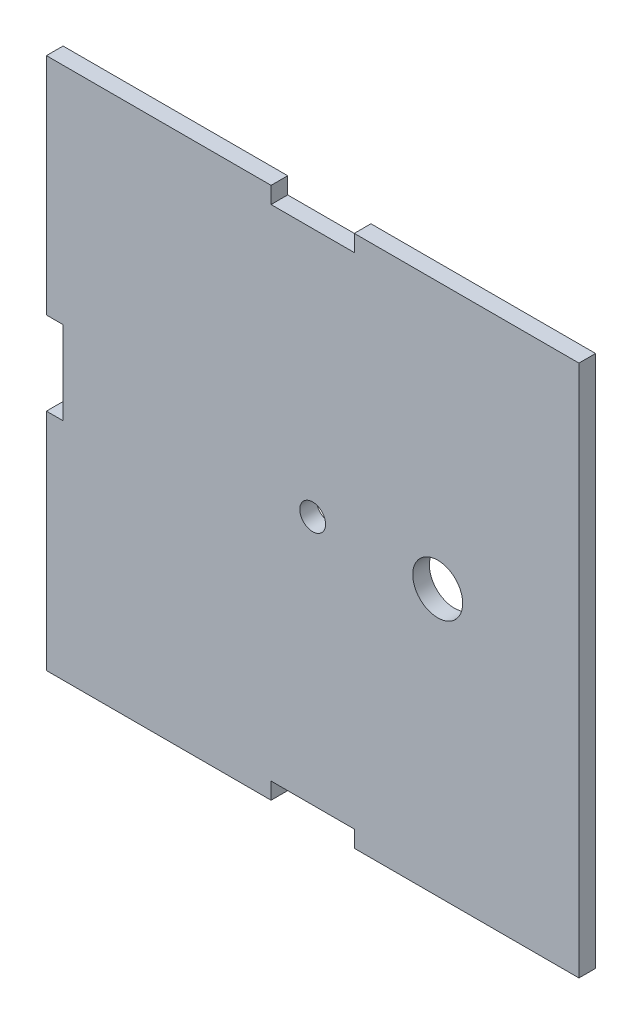
ISO-10303-21;
HEADER;
FILE_DESCRIPTION(('STEP AP214'),'2;1');
FILE_NAME('part.step','',(''),(''),'','','');
FILE_SCHEMA(('AUTOMOTIVE_DESIGN { 1 0 10303 214 1 1 1 1 }'));
ENDSEC;
DATA;
#1=APPLICATION_CONTEXT('core data for automotive mechanical design processes');
#2=APPLICATION_PROTOCOL_DEFINITION('international standard','automotive_design',2000,#1);
#3=PRODUCT_CONTEXT('',#1,'mechanical');
#4=PRODUCT('Part','Part','',(#3));
#5=PRODUCT_RELATED_PRODUCT_CATEGORY('part','',(#4));
#6=PRODUCT_DEFINITION_FORMATION('','',#4);
#7=PRODUCT_DEFINITION_CONTEXT('part definition',#1,'design');
#8=PRODUCT_DEFINITION('design','',#6,#7);
#9=PRODUCT_DEFINITION_SHAPE('','',#8);
#10=(LENGTH_UNIT() NAMED_UNIT(*) SI_UNIT(.MILLI.,.METRE.));
#11=(NAMED_UNIT(*) PLANE_ANGLE_UNIT() SI_UNIT($,.RADIAN.));
#12=(NAMED_UNIT(*) SI_UNIT($,.STERADIAN.) SOLID_ANGLE_UNIT());
#13=UNCERTAINTY_MEASURE_WITH_UNIT(LENGTH_MEASURE(1.E-05),#10,'distance_accuracy_value','');
#14=(GEOMETRIC_REPRESENTATION_CONTEXT(3) GLOBAL_UNCERTAINTY_ASSIGNED_CONTEXT((#13)) GLOBAL_UNIT_ASSIGNED_CONTEXT((#10,
#11,#12)) REPRESENTATION_CONTEXT('',''));
#15=CARTESIAN_POINT('',(0.,0.,0.));
#16=DIRECTION('',(0.,0.,1.));
#17=DIRECTION('',(1.,0.,0.));
#18=AXIS2_PLACEMENT_3D('',#15,#16,#17);
#19=CARTESIAN_POINT('',(16.974358974359,0.,2.));
#20=DIRECTION('',(1.,0.,0.));
#21=DIRECTION('',(0.,0.,-1.));
#22=AXIS2_PLACEMENT_3D('',#19,#20,#21);
#23=PLANE('',#22);
#24=DIRECTION('',(0.,-1.,0.));
#25=VECTOR('',#24,1.);
#26=CARTESIAN_POINT('',(16.974358974359,0.,0.));
#27=LINE('',#26,#25);
#28=CARTESIAN_POINT('',(16.974358974359,42.2051282051282,0.));
#29=VERTEX_POINT('',#28);
#30=CARTESIAN_POINT('',(16.974358974359,-21.7948717948718,0.));
#31=VERTEX_POINT('',#30);
#32=EDGE_CURVE('E184',#29,#31,#27,.T.);
#33=ORIENTED_EDGE('',*,*,#32,.F.);
#34=DIRECTION('',(0.,0.,-1.));
#35=VECTOR('',#34,1.);
#36=CARTESIAN_POINT('',(16.974358974359,42.2051282051282,2.));
#37=LINE('',#36,#35);
#38=CARTESIAN_POINT('',(16.974358974359,42.2051282051282,2.));
#39=VERTEX_POINT('',#38);
#40=EDGE_CURVE('E11',#39,#29,#37,.T.);
#41=ORIENTED_EDGE('',*,*,#40,.F.);
#42=DIRECTION('',(0.,-1.,0.));
#43=VECTOR('',#42,1.);
#44=CARTESIAN_POINT('',(16.974358974359,0.,2.));
#45=LINE('',#44,#43);
#46=CARTESIAN_POINT('',(16.974358974359,-21.7948717948718,2.));
#47=VERTEX_POINT('',#46);
#48=EDGE_CURVE('E220',#39,#47,#45,.T.);
#49=ORIENTED_EDGE('',*,*,#48,.T.);
#50=DIRECTION('',(0.,0.,-1.));
#51=VECTOR('',#50,1.);
#52=CARTESIAN_POINT('',(16.974358974359,-21.7948717948718,2.));
#53=LINE('',#52,#51);
#54=EDGE_CURVE('E58',#47,#31,#53,.T.);
#55=ORIENTED_EDGE('',*,*,#54,.T.);
#56=EDGE_LOOP('',(#33,#41,#49,#55));
#57=FACE_BOUND('',#56,.T.);
#58=ADVANCED_FACE('F41',(#57),#23,.T.);
#59=CARTESIAN_POINT('',(0.,42.2051282051282,2.));
#60=DIRECTION('',(0.,-1.,0.));
#61=DIRECTION('',(0.,0.,-1.));
#62=AXIS2_PLACEMENT_3D('',#59,#60,#61);
#63=PLANE('',#62);
#64=DIRECTION('',(-1.,0.,0.));
#65=VECTOR('',#64,1.);
#66=CARTESIAN_POINT('',(0.,42.2051282051282,0.));
#67=LINE('',#66,#65);
#68=CARTESIAN_POINT('',(-10.025641025641,42.2051282051282,0.));
#69=VERTEX_POINT('',#68);
#70=EDGE_CURVE('E186',#29,#69,#67,.T.);
#71=ORIENTED_EDGE('',*,*,#70,.T.);
#72=DIRECTION('',(0.,0.,-1.));
#73=VECTOR('',#72,1.);
#74=CARTESIAN_POINT('',(-10.025641025641,42.2051282051282,2.));
#75=LINE('',#74,#73);
#76=CARTESIAN_POINT('',(-10.025641025641,42.2051282051282,2.));
#77=VERTEX_POINT('',#76);
#78=EDGE_CURVE('E50',#77,#69,#75,.T.);
#79=ORIENTED_EDGE('',*,*,#78,.F.);
#80=DIRECTION('',(-1.,0.,0.));
#81=VECTOR('',#80,1.);
#82=CARTESIAN_POINT('',(0.,42.2051282051282,2.));
#83=LINE('',#82,#81);
#84=EDGE_CURVE('E416',#39,#77,#83,.T.);
#85=ORIENTED_EDGE('',*,*,#84,.F.);
#86=ORIENTED_EDGE('',*,*,#40,.T.);
#87=EDGE_LOOP('',(#71,#79,#85,#86));
#88=FACE_BOUND('',#87,.T.);
#89=ADVANCED_FACE('F313',(#88),#63,.F.);
#90=CARTESIAN_POINT('',(-10.025641025641,0.,2.));
#91=DIRECTION('',(1.,0.,0.));
#92=DIRECTION('',(0.,0.,-1.));
#93=AXIS2_PLACEMENT_3D('',#90,#91,#92);
#94=PLANE('',#93);
#95=DIRECTION('',(0.,-1.,0.));
#96=VECTOR('',#95,1.);
#97=CARTESIAN_POINT('',(-10.025641025641,0.,0.));
#98=LINE('',#97,#96);
#99=CARTESIAN_POINT('',(-10.025641025641,40.2051282051282,0.));
#100=VERTEX_POINT('',#99);
#101=EDGE_CURVE('E189',#69,#100,#98,.T.);
#102=ORIENTED_EDGE('',*,*,#101,.T.);
#103=DIRECTION('',(0.,0.,-1.));
#104=VECTOR('',#103,1.);
#105=CARTESIAN_POINT('',(-10.025641025641,40.2051282051282,2.));
#106=LINE('',#105,#104);
#107=CARTESIAN_POINT('',(-10.025641025641,40.2051282051282,2.));
#108=VERTEX_POINT('',#107);
#109=EDGE_CURVE('E249',#108,#100,#106,.T.);
#110=ORIENTED_EDGE('',*,*,#109,.F.);
#111=DIRECTION('',(0.,-1.,0.));
#112=VECTOR('',#111,1.);
#113=CARTESIAN_POINT('',(-10.025641025641,0.,2.));
#114=LINE('',#113,#112);
#115=EDGE_CURVE('E259',#77,#108,#114,.T.);
#116=ORIENTED_EDGE('',*,*,#115,.F.);
#117=ORIENTED_EDGE('',*,*,#78,.T.);
#118=EDGE_LOOP('',(#102,#110,#116,#117));
#119=FACE_BOUND('',#118,.T.);
#120=ADVANCED_FACE('F257',(#119),#94,.F.);
#121=CARTESIAN_POINT('',(0.,40.2051282051282,2.));
#122=DIRECTION('',(0.,-1.,0.));
#123=DIRECTION('',(0.,0.,-1.));
#124=AXIS2_PLACEMENT_3D('',#121,#122,#123);
#125=PLANE('',#124);
#126=DIRECTION('',(-1.,0.,0.));
#127=VECTOR('',#126,1.);
#128=CARTESIAN_POINT('',(0.,40.2051282051282,0.));
#129=LINE('',#128,#127);
#130=CARTESIAN_POINT('',(-20.025641025641,40.2051282051282,0.));
#131=VERTEX_POINT('',#130);
#132=EDGE_CURVE('E191',#100,#131,#129,.T.);
#133=ORIENTED_EDGE('',*,*,#132,.T.);
#134=DIRECTION('',(0.,0.,-1.));
#135=VECTOR('',#134,1.);
#136=CARTESIAN_POINT('',(-20.025641025641,40.2051282051282,2.));
#137=LINE('',#136,#135);
#138=CARTESIAN_POINT('',(-20.025641025641,40.2051282051282,2.));
#139=VERTEX_POINT('',#138);
#140=EDGE_CURVE('E246',#139,#131,#137,.T.);
#141=ORIENTED_EDGE('',*,*,#140,.F.);
#142=DIRECTION('',(-1.,0.,0.));
#143=VECTOR('',#142,1.);
#144=CARTESIAN_POINT('',(0.,40.2051282051282,2.));
#145=LINE('',#144,#143);
#146=EDGE_CURVE('E278',#108,#139,#145,.T.);
#147=ORIENTED_EDGE('',*,*,#146,.F.);
#148=ORIENTED_EDGE('',*,*,#109,.T.);
#149=EDGE_LOOP('',(#133,#141,#147,#148));
#150=FACE_BOUND('',#149,.T.);
#151=ADVANCED_FACE('F269',(#150),#125,.F.);
#152=CARTESIAN_POINT('',(-20.025641025641,0.,2.));
#153=DIRECTION('',(-1.,0.,0.));
#154=DIRECTION('',(0.,0.,1.));
#155=AXIS2_PLACEMENT_3D('',#152,#153,#154);
#156=PLANE('',#155);
#157=DIRECTION('',(0.,1.,0.));
#158=VECTOR('',#157,1.);
#159=CARTESIAN_POINT('',(-20.025641025641,0.,0.));
#160=LINE('',#159,#158);
#161=CARTESIAN_POINT('',(-20.025641025641,42.2051282051282,0.));
#162=VERTEX_POINT('',#161);
#163=EDGE_CURVE('E193',#131,#162,#160,.T.);
#164=ORIENTED_EDGE('',*,*,#163,.T.);
#165=DIRECTION('',(0.,0.,-1.));
#166=VECTOR('',#165,1.);
#167=CARTESIAN_POINT('',(-20.025641025641,42.2051282051282,2.));
#168=LINE('',#167,#166);
#169=CARTESIAN_POINT('',(-20.025641025641,42.2051282051282,2.));
#170=VERTEX_POINT('',#169);
#171=EDGE_CURVE('E243',#170,#162,#168,.T.);
#172=ORIENTED_EDGE('',*,*,#171,.F.);
#173=DIRECTION('',(0.,1.,0.));
#174=VECTOR('',#173,1.);
#175=CARTESIAN_POINT('',(-20.025641025641,0.,2.));
#176=LINE('',#175,#174);
#177=EDGE_CURVE('E275',#139,#170,#176,.T.);
#178=ORIENTED_EDGE('',*,*,#177,.F.);
#179=ORIENTED_EDGE('',*,*,#140,.T.);
#180=EDGE_LOOP('',(#164,#172,#178,#179));
#181=FACE_BOUND('',#180,.T.);
#182=ADVANCED_FACE('F273',(#181),#156,.F.);
#183=CARTESIAN_POINT('',(0.,42.2051282051282,2.));
#184=DIRECTION('',(0.,-1.,0.));
#185=DIRECTION('',(1.,0.,0.));
#186=AXIS2_PLACEMENT_3D('',#183,#184,#185);
#187=PLANE('',#186);
#188=DIRECTION('',(-1.,0.,0.));
#189=VECTOR('',#188,1.);
#190=CARTESIAN_POINT('',(0.,42.2051282051282,0.));
#191=LINE('',#190,#189);
#192=CARTESIAN_POINT('',(-47.025641025641,42.2051282051282,0.));
#193=VERTEX_POINT('',#192);
#194=EDGE_CURVE('E195',#162,#193,#191,.T.);
#195=ORIENTED_EDGE('',*,*,#194,.T.);
#196=DIRECTION('',(0.,0.,-1.));
#197=VECTOR('',#196,1.);
#198=CARTESIAN_POINT('',(-47.025641025641,42.2051282051282,2.));
#199=LINE('',#198,#197);
#200=CARTESIAN_POINT('',(-47.025641025641,42.2051282051282,2.));
#201=VERTEX_POINT('',#200);
#202=EDGE_CURVE('E240',#201,#193,#199,.T.);
#203=ORIENTED_EDGE('',*,*,#202,.F.);
#204=DIRECTION('',(-1.,0.,0.));
#205=VECTOR('',#204,1.);
#206=CARTESIAN_POINT('',(0.,42.2051282051282,2.));
#207=LINE('',#206,#205);
#208=EDGE_CURVE('E277',#170,#201,#207,.T.);
#209=ORIENTED_EDGE('',*,*,#208,.F.);
#210=ORIENTED_EDGE('',*,*,#171,.T.);
#211=EDGE_LOOP('',(#195,#203,#209,#210));
#212=FACE_BOUND('',#211,.T.);
#213=ADVANCED_FACE('F326',(#212),#187,.F.);
#214=CARTESIAN_POINT('',(-47.025641025641,0.,2.));
#215=DIRECTION('',(1.,0.,0.));
#216=DIRECTION('',(0.,1.,0.));
#217=AXIS2_PLACEMENT_3D('',#214,#215,#216);
#218=PLANE('',#217);
#219=DIRECTION('',(0.,-1.,0.));
#220=VECTOR('',#219,1.);
#221=CARTESIAN_POINT('',(-47.025641025641,0.,0.));
#222=LINE('',#221,#220);
#223=CARTESIAN_POINT('',(-47.025641025641,15.2051282051282,0.));
#224=VERTEX_POINT('',#223);
#225=EDGE_CURVE('E197',#193,#224,#222,.T.);
#226=ORIENTED_EDGE('',*,*,#225,.T.);
#227=DIRECTION('',(0.,0.,-1.));
#228=VECTOR('',#227,1.);
#229=CARTESIAN_POINT('',(-47.025641025641,15.2051282051282,2.));
#230=LINE('',#229,#228);
#231=CARTESIAN_POINT('',(-47.025641025641,15.2051282051282,2.));
#232=VERTEX_POINT('',#231);
#233=EDGE_CURVE('E237',#232,#224,#230,.T.);
#234=ORIENTED_EDGE('',*,*,#233,.F.);
#235=DIRECTION('',(0.,-1.,0.));
#236=VECTOR('',#235,1.);
#237=CARTESIAN_POINT('',(-47.025641025641,0.,2.));
#238=LINE('',#237,#236);
#239=EDGE_CURVE('E280',#201,#232,#238,.T.);
#240=ORIENTED_EDGE('',*,*,#239,.F.);
#241=ORIENTED_EDGE('',*,*,#202,.T.);
#242=EDGE_LOOP('',(#226,#234,#240,#241));
#243=FACE_BOUND('',#242,.T.);
#244=ADVANCED_FACE('F329',(#243),#218,.F.);
#245=CARTESIAN_POINT('',(0.,15.2051282051282,2.));
#246=DIRECTION('',(0.,1.,0.));
#247=DIRECTION('',(0.,0.,1.));
#248=AXIS2_PLACEMENT_3D('',#245,#246,#247);
#249=PLANE('',#248);
#250=DIRECTION('',(1.,0.,0.));
#251=VECTOR('',#250,1.);
#252=CARTESIAN_POINT('',(0.,15.2051282051282,0.));
#253=LINE('',#252,#251);
#254=CARTESIAN_POINT('',(-45.025641025641,15.2051282051282,0.));
#255=VERTEX_POINT('',#254);
#256=EDGE_CURVE('E199',#224,#255,#253,.T.);
#257=ORIENTED_EDGE('',*,*,#256,.T.);
#258=DIRECTION('',(0.,0.,-1.));
#259=VECTOR('',#258,1.);
#260=CARTESIAN_POINT('',(-45.025641025641,15.2051282051282,2.));
#261=LINE('',#260,#259);
#262=CARTESIAN_POINT('',(-45.025641025641,15.2051282051282,2.));
#263=VERTEX_POINT('',#262);
#264=EDGE_CURVE('E234',#263,#255,#261,.T.);
#265=ORIENTED_EDGE('',*,*,#264,.F.);
#266=DIRECTION('',(1.,0.,0.));
#267=VECTOR('',#266,1.);
#268=CARTESIAN_POINT('',(0.,15.2051282051282,2.));
#269=LINE('',#268,#267);
#270=EDGE_CURVE('E286',#232,#263,#269,.T.);
#271=ORIENTED_EDGE('',*,*,#270,.F.);
#272=ORIENTED_EDGE('',*,*,#233,.T.);
#273=EDGE_LOOP('',(#257,#265,#271,#272));
#274=FACE_BOUND('',#273,.T.);
#275=ADVANCED_FACE('F333',(#274),#249,.F.);
#276=CARTESIAN_POINT('',(-45.025641025641,0.,2.));
#277=DIRECTION('',(1.,0.,0.));
#278=DIRECTION('',(0.,0.,-1.));
#279=AXIS2_PLACEMENT_3D('',#276,#277,#278);
#280=PLANE('',#279);
#281=DIRECTION('',(0.,-1.,0.));
#282=VECTOR('',#281,1.);
#283=CARTESIAN_POINT('',(-45.025641025641,0.,0.));
#284=LINE('',#283,#282);
#285=CARTESIAN_POINT('',(-45.025641025641,5.2051282051282,0.));
#286=VERTEX_POINT('',#285);
#287=EDGE_CURVE('E201',#255,#286,#284,.T.);
#288=ORIENTED_EDGE('',*,*,#287,.T.);
#289=DIRECTION('',(0.,0.,-1.));
#290=VECTOR('',#289,1.);
#291=CARTESIAN_POINT('',(-45.025641025641,5.2051282051282,2.));
#292=LINE('',#291,#290);
#293=CARTESIAN_POINT('',(-45.025641025641,5.2051282051282,2.));
#294=VERTEX_POINT('',#293);
#295=EDGE_CURVE('E231',#294,#286,#292,.T.);
#296=ORIENTED_EDGE('',*,*,#295,.F.);
#297=DIRECTION('',(0.,-1.,0.));
#298=VECTOR('',#297,1.);
#299=CARTESIAN_POINT('',(-45.025641025641,0.,2.));
#300=LINE('',#299,#298);
#301=EDGE_CURVE('E288',#263,#294,#300,.T.);
#302=ORIENTED_EDGE('',*,*,#301,.F.);
#303=ORIENTED_EDGE('',*,*,#264,.T.);
#304=EDGE_LOOP('',(#288,#296,#302,#303));
#305=FACE_BOUND('',#304,.T.);
#306=ADVANCED_FACE('F337',(#305),#280,.F.);
#307=CARTESIAN_POINT('',(0.,5.20512820512822,2.));
#308=DIRECTION('',(0.,-1.,0.));
#309=DIRECTION('',(1.,0.,0.));
#310=AXIS2_PLACEMENT_3D('',#307,#308,#309);
#311=PLANE('',#310);
#312=DIRECTION('',(-1.,0.,0.));
#313=VECTOR('',#312,1.);
#314=CARTESIAN_POINT('',(0.,5.20512820512822,0.));
#315=LINE('',#314,#313);
#316=CARTESIAN_POINT('',(-47.025641025641,5.2051282051282,0.));
#317=VERTEX_POINT('',#316);
#318=EDGE_CURVE('E203',#286,#317,#315,.T.);
#319=ORIENTED_EDGE('',*,*,#318,.T.);
#320=DIRECTION('',(0.,0.,-1.));
#321=VECTOR('',#320,1.);
#322=CARTESIAN_POINT('',(-47.025641025641,5.2051282051282,2.));
#323=LINE('',#322,#321);
#324=CARTESIAN_POINT('',(-47.025641025641,5.2051282051282,2.));
#325=VERTEX_POINT('',#324);
#326=EDGE_CURVE('E228',#325,#317,#323,.T.);
#327=ORIENTED_EDGE('',*,*,#326,.F.);
#328=DIRECTION('',(-1.,0.,0.));
#329=VECTOR('',#328,1.);
#330=CARTESIAN_POINT('',(0.,5.20512820512822,2.));
#331=LINE('',#330,#329);
#332=EDGE_CURVE('E290',#294,#325,#331,.T.);
#333=ORIENTED_EDGE('',*,*,#332,.F.);
#334=ORIENTED_EDGE('',*,*,#295,.T.);
#335=EDGE_LOOP('',(#319,#327,#333,#334));
#336=FACE_BOUND('',#335,.T.);
#337=ADVANCED_FACE('F341',(#336),#311,.F.);
#338=CARTESIAN_POINT('',(-47.025641025641,0.,2.));
#339=DIRECTION('',(1.,0.,0.));
#340=DIRECTION('',(0.,0.,-1.));
#341=AXIS2_PLACEMENT_3D('',#338,#339,#340);
#342=PLANE('',#341);
#343=DIRECTION('',(0.,-1.,0.));
#344=VECTOR('',#343,1.);
#345=CARTESIAN_POINT('',(-47.025641025641,0.,0.));
#346=LINE('',#345,#344);
#347=CARTESIAN_POINT('',(-47.025641025641,-21.7948717948718,0.));
#348=VERTEX_POINT('',#347);
#349=EDGE_CURVE('E205',#317,#348,#346,.T.);
#350=ORIENTED_EDGE('',*,*,#349,.T.);
#351=DIRECTION('',(0.,0.,-1.));
#352=VECTOR('',#351,1.);
#353=CARTESIAN_POINT('',(-47.025641025641,-21.7948717948718,2.));
#354=LINE('',#353,#352);
#355=CARTESIAN_POINT('',(-47.025641025641,-21.7948717948718,2.));
#356=VERTEX_POINT('',#355);
#357=EDGE_CURVE('E226',#356,#348,#354,.T.);
#358=ORIENTED_EDGE('',*,*,#357,.F.);
#359=DIRECTION('',(0.,-1.,0.));
#360=VECTOR('',#359,1.);
#361=CARTESIAN_POINT('',(-47.025641025641,0.,2.));
#362=LINE('',#361,#360);
#363=EDGE_CURVE('E292',#325,#356,#362,.T.);
#364=ORIENTED_EDGE('',*,*,#363,.F.);
#365=ORIENTED_EDGE('',*,*,#326,.T.);
#366=EDGE_LOOP('',(#350,#358,#364,#365));
#367=FACE_BOUND('',#366,.T.);
#368=ADVANCED_FACE('F345',(#367),#342,.F.);
#369=CARTESIAN_POINT('',(0.,-21.7948717948718,2.));
#370=DIRECTION('',(0.,-1.,0.));
#371=DIRECTION('',(0.,0.,-1.));
#372=AXIS2_PLACEMENT_3D('',#369,#370,#371);
#373=PLANE('',#372);
#374=DIRECTION('',(-1.,0.,0.));
#375=VECTOR('',#374,1.);
#376=CARTESIAN_POINT('',(0.,-21.7948717948718,0.));
#377=LINE('',#376,#375);
#378=CARTESIAN_POINT('',(-20.025641025641,-21.7948717948718,0.));
#379=VERTEX_POINT('',#378);
#380=EDGE_CURVE('E208',#379,#348,#377,.T.);
#381=ORIENTED_EDGE('',*,*,#380,.F.);
#382=DIRECTION('',(0.,0.,-1.));
#383=VECTOR('',#382,1.);
#384=CARTESIAN_POINT('',(-20.025641025641,-21.7948717948718,2.));
#385=LINE('',#384,#383);
#386=CARTESIAN_POINT('',(-20.025641025641,-21.7948717948718,2.));
#387=VERTEX_POINT('',#386);
#388=EDGE_CURVE('E224',#387,#379,#385,.T.);
#389=ORIENTED_EDGE('',*,*,#388,.F.);
#390=DIRECTION('',(-1.,0.,0.));
#391=VECTOR('',#390,1.);
#392=CARTESIAN_POINT('',(0.,-21.7948717948718,2.));
#393=LINE('',#392,#391);
#394=EDGE_CURVE('E294',#387,#356,#393,.T.);
#395=ORIENTED_EDGE('',*,*,#394,.T.);
#396=ORIENTED_EDGE('',*,*,#357,.T.);
#397=EDGE_LOOP('',(#381,#389,#395,#396));
#398=FACE_BOUND('',#397,.T.);
#399=ADVANCED_FACE('F349',(#398),#373,.T.);
#400=CARTESIAN_POINT('',(-20.025641025641,0.,2.));
#401=DIRECTION('',(1.,0.,0.));
#402=DIRECTION('',(0.,0.,-1.));
#403=AXIS2_PLACEMENT_3D('',#400,#401,#402);
#404=PLANE('',#403);
#405=DIRECTION('',(0.,-1.,0.));
#406=VECTOR('',#405,1.);
#407=CARTESIAN_POINT('',(-20.025641025641,0.,0.));
#408=LINE('',#407,#406);
#409=CARTESIAN_POINT('',(-20.025641025641,-19.7948717948718,0.));
#410=VERTEX_POINT('',#409);
#411=EDGE_CURVE('E211',#410,#379,#408,.T.);
#412=ORIENTED_EDGE('',*,*,#411,.F.);
#413=DIRECTION('',(0.,0.,-1.));
#414=VECTOR('',#413,1.);
#415=CARTESIAN_POINT('',(-20.025641025641,-19.7948717948718,2.));
#416=LINE('',#415,#414);
#417=CARTESIAN_POINT('',(-20.025641025641,-19.7948717948718,2.));
#418=VERTEX_POINT('',#417);
#419=EDGE_CURVE('E165',#418,#410,#416,.T.);
#420=ORIENTED_EDGE('',*,*,#419,.F.);
#421=DIRECTION('',(0.,-1.,0.));
#422=VECTOR('',#421,1.);
#423=CARTESIAN_POINT('',(-20.025641025641,0.,2.));
#424=LINE('',#423,#422);
#425=EDGE_CURVE('E176',#418,#387,#424,.T.);
#426=ORIENTED_EDGE('',*,*,#425,.T.);
#427=ORIENTED_EDGE('',*,*,#388,.T.);
#428=EDGE_LOOP('',(#412,#420,#426,#427));
#429=FACE_BOUND('',#428,.T.);
#430=ADVANCED_FACE('F298',(#429),#404,.T.);
#431=CARTESIAN_POINT('',(0.,-19.7948717948718,2.));
#432=DIRECTION('',(0.,-1.,0.));
#433=DIRECTION('',(0.,0.,-1.));
#434=AXIS2_PLACEMENT_3D('',#431,#432,#433);
#435=PLANE('',#434);
#436=DIRECTION('',(-1.,0.,0.));
#437=VECTOR('',#436,1.);
#438=CARTESIAN_POINT('',(0.,-19.7948717948718,0.));
#439=LINE('',#438,#437);
#440=CARTESIAN_POINT('',(-10.025641025641,-19.7948717948718,0.));
#441=VERTEX_POINT('',#440);
#442=EDGE_CURVE('E161',#441,#410,#439,.T.);
#443=ORIENTED_EDGE('',*,*,#442,.F.);
#444=DIRECTION('',(0.,0.,-1.));
#445=VECTOR('',#444,1.);
#446=CARTESIAN_POINT('',(-10.025641025641,-19.7948717948718,2.));
#447=LINE('',#446,#445);
#448=CARTESIAN_POINT('',(-10.025641025641,-19.7948717948718,2.));
#449=VERTEX_POINT('',#448);
#450=EDGE_CURVE('E156',#449,#441,#447,.T.);
#451=ORIENTED_EDGE('',*,*,#450,.F.);
#452=DIRECTION('',(-1.,0.,0.));
#453=VECTOR('',#452,1.);
#454=CARTESIAN_POINT('',(0.,-19.7948717948718,2.));
#455=LINE('',#454,#453);
#456=EDGE_CURVE('E159',#449,#418,#455,.T.);
#457=ORIENTED_EDGE('',*,*,#456,.T.);
#458=ORIENTED_EDGE('',*,*,#419,.T.);
#459=EDGE_LOOP('',(#443,#451,#457,#458));
#460=FACE_BOUND('',#459,.T.);
#461=ADVANCED_FACE('F158',(#460),#435,.T.);
#462=CARTESIAN_POINT('',(-10.025641025641,0.,2.));
#463=DIRECTION('',(-1.,0.,0.));
#464=DIRECTION('',(0.,0.,1.));
#465=AXIS2_PLACEMENT_3D('',#462,#463,#464);
#466=PLANE('',#465);
#467=DIRECTION('',(0.,1.,0.));
#468=VECTOR('',#467,1.);
#469=CARTESIAN_POINT('',(-10.025641025641,0.,0.));
#470=LINE('',#469,#468);
#471=CARTESIAN_POINT('',(-10.025641025641,-21.7948717948718,0.));
#472=VERTEX_POINT('',#471);
#473=EDGE_CURVE('E215',#472,#441,#470,.T.);
#474=ORIENTED_EDGE('',*,*,#473,.F.);
#475=DIRECTION('',(0.,0.,-1.));
#476=VECTOR('',#475,1.);
#477=CARTESIAN_POINT('',(-10.025641025641,-21.7948717948718,2.));
#478=LINE('',#477,#476);
#479=CARTESIAN_POINT('',(-10.025641025641,-21.7948717948718,2.));
#480=VERTEX_POINT('',#479);
#481=EDGE_CURVE('E107',#480,#472,#478,.T.);
#482=ORIENTED_EDGE('',*,*,#481,.F.);
#483=DIRECTION('',(0.,1.,0.));
#484=VECTOR('',#483,1.);
#485=CARTESIAN_POINT('',(-10.025641025641,0.,2.));
#486=LINE('',#485,#484);
#487=EDGE_CURVE('E173',#480,#449,#486,.T.);
#488=ORIENTED_EDGE('',*,*,#487,.T.);
#489=ORIENTED_EDGE('',*,*,#450,.T.);
#490=EDGE_LOOP('',(#474,#482,#488,#489));
#491=FACE_BOUND('',#490,.T.);
#492=ADVANCED_FACE('F178',(#491),#466,.T.);
#493=CARTESIAN_POINT('',(0.,-21.7948717948718,2.));
#494=DIRECTION('',(0.,-1.,0.));
#495=DIRECTION('',(0.,0.,-1.));
#496=AXIS2_PLACEMENT_3D('',#493,#494,#495);
#497=PLANE('',#496);
#498=DIRECTION('',(-1.,0.,0.));
#499=VECTOR('',#498,1.);
#500=CARTESIAN_POINT('',(0.,-21.7948717948718,0.));
#501=LINE('',#500,#499);
#502=EDGE_CURVE('E217',#31,#472,#501,.T.);
#503=ORIENTED_EDGE('',*,*,#502,.F.);
#504=ORIENTED_EDGE('',*,*,#54,.F.);
#505=DIRECTION('',(-1.,0.,0.));
#506=VECTOR('',#505,1.);
#507=CARTESIAN_POINT('',(0.,-21.7948717948718,2.));
#508=LINE('',#507,#506);
#509=EDGE_CURVE('E179',#47,#480,#508,.T.);
#510=ORIENTED_EDGE('',*,*,#509,.T.);
#511=ORIENTED_EDGE('',*,*,#481,.T.);
#512=EDGE_LOOP('',(#503,#504,#510,#511));
#513=FACE_BOUND('',#512,.T.);
#514=ADVANCED_FACE('F300',(#513),#497,.T.);
#515=CARTESIAN_POINT('',(0.,0.,2.));
#516=DIRECTION('',(0.,0.,1.));
#517=DIRECTION('',(1.,0.,0.));
#518=AXIS2_PLACEMENT_3D('',#515,#516,#517);
#519=PLANE('',#518);
#520=CARTESIAN_POINT('',(0.,10.2051282051282,2.));
#521=DIRECTION('',(0.,0.,1.));
#522=DIRECTION('',(1.,0.,0.));
#523=AXIS2_PLACEMENT_3D('',#520,#521,#522);
#524=CIRCLE('',#523,3.);
#525=CARTESIAN_POINT('',(3.,10.2051282051282,2.));
#526=VERTEX_POINT('',#525);
#527=EDGE_CURVE('E405',#526,#526,#524,.T.);
#528=ORIENTED_EDGE('',*,*,#527,.F.);
#529=EDGE_LOOP('',(#528));
#530=FACE_BOUND('',#529,.T.);
#531=CARTESIAN_POINT('',(-15.0256410256432,10.2051282051282,2.));
#532=DIRECTION('',(0.,0.,1.));
#533=DIRECTION('',(1.,0.,0.));
#534=AXIS2_PLACEMENT_3D('',#531,#532,#533);
#535=CIRCLE('',#534,1.55);
#536=CARTESIAN_POINT('',(-13.4756410256432,10.2051282051282,2.));
#537=VERTEX_POINT('',#536);
#538=EDGE_CURVE('E187',#537,#537,#535,.F.);
#539=ORIENTED_EDGE('',*,*,#538,.T.);
#540=EDGE_LOOP('',(#539));
#541=FACE_BOUND('',#540,.T.);
#542=ORIENTED_EDGE('',*,*,#48,.F.);
#543=ORIENTED_EDGE('',*,*,#84,.T.);
#544=ORIENTED_EDGE('',*,*,#115,.T.);
#545=ORIENTED_EDGE('',*,*,#146,.T.);
#546=ORIENTED_EDGE('',*,*,#177,.T.);
#547=ORIENTED_EDGE('',*,*,#208,.T.);
#548=ORIENTED_EDGE('',*,*,#239,.T.);
#549=ORIENTED_EDGE('',*,*,#270,.T.);
#550=ORIENTED_EDGE('',*,*,#301,.T.);
#551=ORIENTED_EDGE('',*,*,#332,.T.);
#552=ORIENTED_EDGE('',*,*,#363,.T.);
#553=ORIENTED_EDGE('',*,*,#394,.F.);
#554=ORIENTED_EDGE('',*,*,#425,.F.);
#555=ORIENTED_EDGE('',*,*,#456,.F.);
#556=ORIENTED_EDGE('',*,*,#487,.F.);
#557=ORIENTED_EDGE('',*,*,#509,.F.);
#558=EDGE_LOOP('',(#542,#543,#544,#545,#546,#547,#548,#549,#550,#551,#552,#553,#554,#555,#556,#557));
#559=FACE_BOUND('',#558,.T.);
#560=ADVANCED_FACE('F171',(#530,#541,#559),#519,.T.);
#561=CARTESIAN_POINT('',(0.,0.,0.));
#562=DIRECTION('',(0.,0.,1.));
#563=DIRECTION('',(1.,0.,0.));
#564=AXIS2_PLACEMENT_3D('',#561,#562,#563);
#565=PLANE('',#564);
#566=CARTESIAN_POINT('',(0.,10.2051282051282,0.));
#567=DIRECTION('',(0.,0.,1.));
#568=DIRECTION('',(1.,0.,0.));
#569=AXIS2_PLACEMENT_3D('',#566,#567,#568);
#570=CIRCLE('',#569,3.);
#571=CARTESIAN_POINT('',(3.,10.2051282051282,0.));
#572=VERTEX_POINT('',#571);
#573=EDGE_CURVE('E44',#572,#572,#570,.T.);
#574=ORIENTED_EDGE('',*,*,#573,.T.);
#575=EDGE_LOOP('',(#574));
#576=FACE_BOUND('',#575,.T.);
#577=CARTESIAN_POINT('',(-15.0256410256432,10.2051282051282,0.));
#578=DIRECTION('',(0.,0.,1.));
#579=DIRECTION('',(1.,0.,0.));
#580=AXIS2_PLACEMENT_3D('',#577,#578,#579);
#581=CIRCLE('',#580,1.55);
#582=CARTESIAN_POINT('',(-13.4756410256432,10.2051282051282,0.));
#583=VERTEX_POINT('',#582);
#584=EDGE_CURVE('E408',#583,#583,#581,.T.);
#585=ORIENTED_EDGE('',*,*,#584,.T.);
#586=EDGE_LOOP('',(#585));
#587=FACE_BOUND('',#586,.T.);
#588=ORIENTED_EDGE('',*,*,#32,.T.);
#589=ORIENTED_EDGE('',*,*,#502,.T.);
#590=ORIENTED_EDGE('',*,*,#473,.T.);
#591=ORIENTED_EDGE('',*,*,#442,.T.);
#592=ORIENTED_EDGE('',*,*,#411,.T.);
#593=ORIENTED_EDGE('',*,*,#380,.T.);
#594=ORIENTED_EDGE('',*,*,#349,.F.);
#595=ORIENTED_EDGE('',*,*,#318,.F.);
#596=ORIENTED_EDGE('',*,*,#287,.F.);
#597=ORIENTED_EDGE('',*,*,#256,.F.);
#598=ORIENTED_EDGE('',*,*,#225,.F.);
#599=ORIENTED_EDGE('',*,*,#194,.F.);
#600=ORIENTED_EDGE('',*,*,#163,.F.);
#601=ORIENTED_EDGE('',*,*,#132,.F.);
#602=ORIENTED_EDGE('',*,*,#101,.F.);
#603=ORIENTED_EDGE('',*,*,#70,.F.);
#604=EDGE_LOOP('',(#588,#589,#590,#591,#592,#593,#594,#595,#596,#597,#598,#599,#600,#601,#602,#603));
#605=FACE_BOUND('',#604,.T.);
#606=ADVANCED_FACE('F264',(#576,#587,#605),#565,.F.);
#607=CARTESIAN_POINT('',(-15.0256410256432,10.2051282051282,5.));
#608=DIRECTION('',(0.,0.,-1.));
#609=DIRECTION('',(-1.,0.,0.));
#610=AXIS2_PLACEMENT_3D('',#607,#608,#609);
#611=CYLINDRICAL_SURFACE('',#610,1.55);
#612=ORIENTED_EDGE('',*,*,#538,.F.);
#613=EDGE_LOOP('',(#612));
#614=FACE_BOUND('',#613,.T.);
#615=ORIENTED_EDGE('',*,*,#584,.F.);
#616=EDGE_LOOP('',(#615));
#617=FACE_BOUND('',#616,.T.);
#618=ADVANCED_FACE('F375',(#614,#617),#611,.F.);
#619=CARTESIAN_POINT('',(0.,10.2051282051282,-8.));
#620=DIRECTION('',(0.,0.,1.));
#621=DIRECTION('',(1.,0.,0.));
#622=AXIS2_PLACEMENT_3D('',#619,#620,#621);
#623=CYLINDRICAL_SURFACE('',#622,3.);
#624=ORIENTED_EDGE('',*,*,#527,.T.);
#625=EDGE_LOOP('',(#624));
#626=FACE_BOUND('',#625,.T.);
#627=ORIENTED_EDGE('',*,*,#573,.F.);
#628=EDGE_LOOP('',(#627));
#629=FACE_BOUND('',#628,.T.);
#630=ADVANCED_FACE('F379',(#626,#629),#623,.F.);
#631=CLOSED_SHELL('',(#58,#89,#120,#151,#182,#213,#244,#275,#306,#337,#368,#399,#430,#461,#492,
#514,#560,#606,#618,#630));
#632=MANIFOLD_SOLID_BREP('B2',#631);
#633=ADVANCED_BREP_SHAPE_REPRESENTATION('',(#18,#632),#14);
#634=SHAPE_DEFINITION_REPRESENTATION(#9,#633);
ENDSEC;
END-ISO-10303-21;
